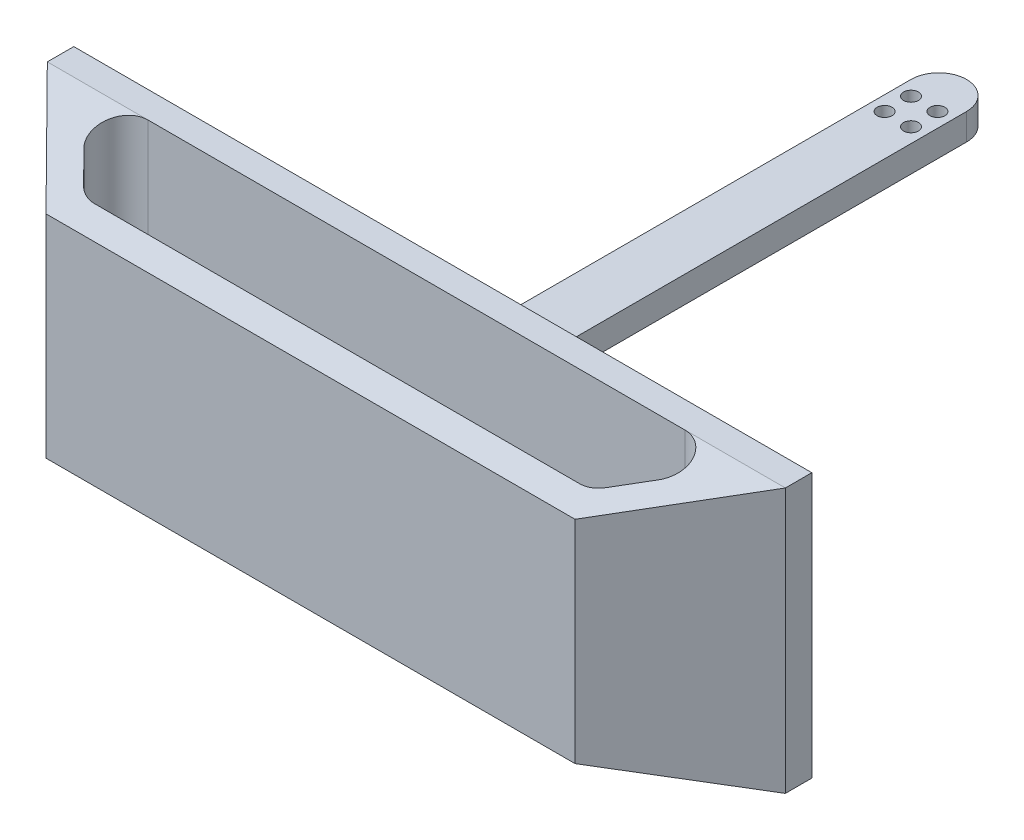
ISO-10303-21;
HEADER;
FILE_DESCRIPTION(('STEP AP214'),'2;1');
FILE_NAME('part.step','',(''),(''),'','','');
FILE_SCHEMA(('AUTOMOTIVE_DESIGN { 1 0 10303 214 1 1 1 1 }'));
ENDSEC;
DATA;
#1=APPLICATION_CONTEXT('core data for automotive mechanical design processes');
#2=APPLICATION_PROTOCOL_DEFINITION('international standard','automotive_design',2000,#1);
#3=PRODUCT_CONTEXT('',#1,'mechanical');
#4=PRODUCT('Part','Part','',(#3));
#5=PRODUCT_RELATED_PRODUCT_CATEGORY('part','',(#4));
#6=PRODUCT_DEFINITION_FORMATION('','',#4);
#7=PRODUCT_DEFINITION_CONTEXT('part definition',#1,'design');
#8=PRODUCT_DEFINITION('design','',#6,#7);
#9=PRODUCT_DEFINITION_SHAPE('','',#8);
#10=(LENGTH_UNIT() NAMED_UNIT(*) SI_UNIT(.MILLI.,.METRE.));
#11=(NAMED_UNIT(*) PLANE_ANGLE_UNIT() SI_UNIT($,.RADIAN.));
#12=(NAMED_UNIT(*) SI_UNIT($,.STERADIAN.) SOLID_ANGLE_UNIT());
#13=UNCERTAINTY_MEASURE_WITH_UNIT(LENGTH_MEASURE(1.E-05),#10,'distance_accuracy_value','');
#14=(GEOMETRIC_REPRESENTATION_CONTEXT(3) GLOBAL_UNCERTAINTY_ASSIGNED_CONTEXT((#13)) GLOBAL_UNIT_ASSIGNED_CONTEXT((#10,
#11,#12)) REPRESENTATION_CONTEXT('',''));
#15=CARTESIAN_POINT('',(0.,0.,0.));
#16=DIRECTION('',(0.,0.,1.));
#17=DIRECTION('',(1.,0.,0.));
#18=AXIS2_PLACEMENT_3D('',#15,#16,#17);
#19=CARTESIAN_POINT('',(0.,5.,-5.25));
#20=DIRECTION('',(0.,-1.,0.));
#21=DIRECTION('',(0.,0.,-1.));
#22=AXIS2_PLACEMENT_3D('',#19,#20,#21);
#23=PLANE('',#22);
#24=CARTESIAN_POINT('',(0.,5.,-5.25));
#25=DIRECTION('',(0.,1.,0.));
#26=DIRECTION('',(0.,0.,-1.));
#27=AXIS2_PLACEMENT_3D('',#24,#25,#26);
#28=CIRCLE('',#27,5.25);
#29=CARTESIAN_POINT('',(5.25,5.,-5.25));
#30=VERTEX_POINT('',#29);
#31=CARTESIAN_POINT('',(-5.25,5.,-5.25));
#32=VERTEX_POINT('',#31);
#33=EDGE_CURVE('E605',#30,#32,#28,.T.);
#34=ORIENTED_EDGE('',*,*,#33,.T.);
#35=DIRECTION('',(0.,0.,1.));
#36=VECTOR('',#35,1.);
#37=CARTESIAN_POINT('',(-5.25,5.,-5.25));
#38=LINE('',#37,#36);
#39=CARTESIAN_POINT('',(-5.24999999999999,5.,88.5));
#40=VERTEX_POINT('',#39);
#41=EDGE_CURVE('E608',#32,#40,#38,.T.);
#42=ORIENTED_EDGE('',*,*,#41,.T.);
#43=DIRECTION('',(1.,0.,0.));
#44=VECTOR('',#43,1.);
#45=CARTESIAN_POINT('',(-5.24999999999999,5.,88.5));
#46=LINE('',#45,#44);
#47=CARTESIAN_POINT('',(5.25000000000001,5.,88.5));
#48=VERTEX_POINT('',#47);
#49=EDGE_CURVE('E613',#40,#48,#46,.T.);
#50=ORIENTED_EDGE('',*,*,#49,.T.);
#51=DIRECTION('',(0.,0.,-1.));
#52=VECTOR('',#51,1.);
#53=CARTESIAN_POINT('',(5.25,5.,-5.25));
#54=LINE('',#53,#52);
#55=EDGE_CURVE('E617',#48,#30,#54,.T.);
#56=ORIENTED_EDGE('',*,*,#55,.T.);
#57=EDGE_LOOP('',(#34,#42,#50,#56));
#58=FACE_BOUND('',#57,.T.);
#59=CARTESIAN_POINT('',(-2.5,5.,-2.5));
#60=DIRECTION('',(0.,1.,0.));
#61=DIRECTION('',(0.,0.,1.));
#62=AXIS2_PLACEMENT_3D('',#59,#60,#61);
#63=CIRCLE('',#62,1.4);
#64=CARTESIAN_POINT('',(-2.5,5.,-1.1));
#65=VERTEX_POINT('',#64);
#66=EDGE_CURVE('E588',#65,#65,#63,.T.);
#67=ORIENTED_EDGE('',*,*,#66,.F.);
#68=EDGE_LOOP('',(#67));
#69=FACE_BOUND('',#68,.T.);
#70=CARTESIAN_POINT('',(2.5,5.,-2.5));
#71=DIRECTION('',(0.,1.,0.));
#72=DIRECTION('',(0.,0.,-1.));
#73=AXIS2_PLACEMENT_3D('',#70,#71,#72);
#74=CIRCLE('',#73,1.4);
#75=CARTESIAN_POINT('',(2.5,5.,-3.9));
#76=VERTEX_POINT('',#75);
#77=EDGE_CURVE('E594',#76,#76,#74,.T.);
#78=ORIENTED_EDGE('',*,*,#77,.F.);
#79=EDGE_LOOP('',(#78));
#80=FACE_BOUND('',#79,.T.);
#81=CARTESIAN_POINT('',(-2.50000000000001,5.,2.5));
#82=DIRECTION('',(0.,1.,0.));
#83=DIRECTION('',(0.,0.,-1.));
#84=AXIS2_PLACEMENT_3D('',#81,#82,#83);
#85=CIRCLE('',#84,1.4);
#86=CARTESIAN_POINT('',(-2.50000000000001,5.,1.1));
#87=VERTEX_POINT('',#86);
#88=EDGE_CURVE('E834',#87,#87,#85,.T.);
#89=ORIENTED_EDGE('',*,*,#88,.F.);
#90=EDGE_LOOP('',(#89));
#91=FACE_BOUND('',#90,.T.);
#92=CARTESIAN_POINT('',(2.49999999999999,5.,2.5));
#93=DIRECTION('',(0.,1.,0.));
#94=DIRECTION('',(0.,0.,1.));
#95=AXIS2_PLACEMENT_3D('',#92,#93,#94);
#96=CIRCLE('',#95,1.4);
#97=CARTESIAN_POINT('',(2.49999999999999,5.,3.9));
#98=VERTEX_POINT('',#97);
#99=EDGE_CURVE('E826',#98,#98,#96,.T.);
#100=ORIENTED_EDGE('',*,*,#99,.F.);
#101=EDGE_LOOP('',(#100));
#102=FACE_BOUND('',#101,.T.);
#103=ADVANCED_FACE('F52',(#58,#69,#80,#91,#102),#23,.F.);
#104=CARTESIAN_POINT('',(0.,0.,-5.25));
#105=DIRECTION('',(0.,-1.,0.));
#106=DIRECTION('',(0.,0.,-1.));
#107=AXIS2_PLACEMENT_3D('',#104,#105,#106);
#108=PLANE('',#107);
#109=CARTESIAN_POINT('',(-2.50000000000001,0.,2.5));
#110=DIRECTION('',(0.,1.,0.));
#111=DIRECTION('',(0.,0.,-1.));
#112=AXIS2_PLACEMENT_3D('',#109,#110,#111);
#113=CIRCLE('',#112,1.4);
#114=CARTESIAN_POINT('',(-2.50000000000001,0.,1.1));
#115=VERTEX_POINT('',#114);
#116=EDGE_CURVE('E830',#115,#115,#113,.T.);
#117=ORIENTED_EDGE('',*,*,#116,.T.);
#118=EDGE_LOOP('',(#117));
#119=FACE_BOUND('',#118,.T.);
#120=CARTESIAN_POINT('',(-2.5,0.,-2.5));
#121=DIRECTION('',(0.,1.,0.));
#122=DIRECTION('',(0.,0.,1.));
#123=AXIS2_PLACEMENT_3D('',#120,#121,#122);
#124=CIRCLE('',#123,1.4);
#125=CARTESIAN_POINT('',(-2.5,0.,-1.1));
#126=VERTEX_POINT('',#125);
#127=EDGE_CURVE('E591',#126,#126,#124,.T.);
#128=ORIENTED_EDGE('',*,*,#127,.T.);
#129=EDGE_LOOP('',(#128));
#130=FACE_BOUND('',#129,.T.);
#131=CARTESIAN_POINT('',(0.,0.,-5.25));
#132=DIRECTION('',(0.,1.,0.));
#133=DIRECTION('',(0.,0.,-1.));
#134=AXIS2_PLACEMENT_3D('',#131,#132,#133);
#135=CIRCLE('',#134,5.25);
#136=CARTESIAN_POINT('',(5.25,0.,-5.25));
#137=VERTEX_POINT('',#136);
#138=CARTESIAN_POINT('',(-5.25,0.,-5.25));
#139=VERTEX_POINT('',#138);
#140=EDGE_CURVE('E598',#137,#139,#135,.T.);
#141=ORIENTED_EDGE('',*,*,#140,.F.);
#142=DIRECTION('',(0.,0.,-1.));
#143=VECTOR('',#142,1.);
#144=CARTESIAN_POINT('',(5.25,0.,-5.25));
#145=LINE('',#144,#143);
#146=CARTESIAN_POINT('',(5.25000000000001,0.,88.5));
#147=VERTEX_POINT('',#146);
#148=EDGE_CURVE('E609',#147,#137,#145,.T.);
#149=ORIENTED_EDGE('',*,*,#148,.F.);
#150=DIRECTION('',(1.,0.,0.));
#151=VECTOR('',#150,1.);
#152=CARTESIAN_POINT('',(-5.24999999999999,0.,88.5));
#153=LINE('',#152,#151);
#154=CARTESIAN_POINT('',(-5.24999999999999,0.,88.5));
#155=VERTEX_POINT('',#154);
#156=EDGE_CURVE('E629',#155,#147,#153,.T.);
#157=ORIENTED_EDGE('',*,*,#156,.F.);
#158=DIRECTION('',(0.,0.,1.));
#159=VECTOR('',#158,1.);
#160=CARTESIAN_POINT('',(-5.25,0.,-5.25));
#161=LINE('',#160,#159);
#162=EDGE_CURVE('E625',#139,#155,#161,.T.);
#163=ORIENTED_EDGE('',*,*,#162,.F.);
#164=EDGE_LOOP('',(#141,#149,#157,#163));
#165=FACE_BOUND('',#164,.T.);
#166=CARTESIAN_POINT('',(2.5,0.,-2.5));
#167=DIRECTION('',(0.,1.,0.));
#168=DIRECTION('',(0.,0.,-1.));
#169=AXIS2_PLACEMENT_3D('',#166,#167,#168);
#170=CIRCLE('',#169,1.4);
#171=CARTESIAN_POINT('',(2.5,0.,-3.9));
#172=VERTEX_POINT('',#171);
#173=EDGE_CURVE('E601',#172,#172,#170,.T.);
#174=ORIENTED_EDGE('',*,*,#173,.T.);
#175=EDGE_LOOP('',(#174));
#176=FACE_BOUND('',#175,.T.);
#177=CARTESIAN_POINT('',(2.49999999999999,0.,2.5));
#178=DIRECTION('',(0.,1.,0.));
#179=DIRECTION('',(0.,0.,1.));
#180=AXIS2_PLACEMENT_3D('',#177,#178,#179);
#181=CIRCLE('',#180,1.4);
#182=CARTESIAN_POINT('',(2.49999999999999,0.,3.9));
#183=VERTEX_POINT('',#182);
#184=EDGE_CURVE('E668',#183,#183,#181,.T.);
#185=ORIENTED_EDGE('',*,*,#184,.T.);
#186=EDGE_LOOP('',(#185));
#187=FACE_BOUND('',#186,.T.);
#188=ADVANCED_FACE('F327',(#119,#130,#165,#176,#187),#108,.T.);
#189=CARTESIAN_POINT('',(0.,5.,-5.25));
#190=DIRECTION('',(0.,-1.,0.));
#191=DIRECTION('',(0.,0.,-1.));
#192=AXIS2_PLACEMENT_3D('',#189,#190,#191);
#193=CYLINDRICAL_SURFACE('',#192,5.25);
#194=ORIENTED_EDGE('',*,*,#140,.T.);
#195=DIRECTION('',(0.,-1.,0.));
#196=VECTOR('',#195,1.);
#197=CARTESIAN_POINT('',(-5.25,5.,-5.25));
#198=LINE('',#197,#196);
#199=EDGE_CURVE('E647',#32,#139,#198,.T.);
#200=ORIENTED_EDGE('',*,*,#199,.F.);
#201=ORIENTED_EDGE('',*,*,#33,.F.);
#202=DIRECTION('',(0.,-1.,0.));
#203=VECTOR('',#202,1.);
#204=CARTESIAN_POINT('',(5.25,5.,-5.25));
#205=LINE('',#204,#203);
#206=EDGE_CURVE('E621',#30,#137,#205,.T.);
#207=ORIENTED_EDGE('',*,*,#206,.T.);
#208=EDGE_LOOP('',(#194,#200,#201,#207));
#209=FACE_BOUND('',#208,.T.);
#210=ADVANCED_FACE('F334',(#209),#193,.T.);
#211=CARTESIAN_POINT('',(-5.25,5.,-5.25));
#212=DIRECTION('',(1.,0.,0.));
#213=DIRECTION('',(0.,0.,-1.));
#214=AXIS2_PLACEMENT_3D('',#211,#212,#213);
#215=PLANE('',#214);
#216=ORIENTED_EDGE('',*,*,#162,.T.);
#217=DIRECTION('',(0.,-1.,0.));
#218=VECTOR('',#217,1.);
#219=CARTESIAN_POINT('',(-5.24999999999999,5.,88.5));
#220=LINE('',#219,#218);
#221=EDGE_CURVE('E643',#40,#155,#220,.T.);
#222=ORIENTED_EDGE('',*,*,#221,.F.);
#223=ORIENTED_EDGE('',*,*,#41,.F.);
#224=ORIENTED_EDGE('',*,*,#199,.T.);
#225=EDGE_LOOP('',(#216,#222,#223,#224));
#226=FACE_BOUND('',#225,.T.);
#227=ADVANCED_FACE('F346',(#226),#215,.F.);
#228=CARTESIAN_POINT('',(5.25,5.,-5.25));
#229=DIRECTION('',(-1.,0.,0.));
#230=DIRECTION('',(0.,0.,1.));
#231=AXIS2_PLACEMENT_3D('',#228,#229,#230);
#232=PLANE('',#231);
#233=ORIENTED_EDGE('',*,*,#148,.T.);
#234=ORIENTED_EDGE('',*,*,#206,.F.);
#235=ORIENTED_EDGE('',*,*,#55,.F.);
#236=DIRECTION('',(0.,-1.,0.));
#237=VECTOR('',#236,1.);
#238=CARTESIAN_POINT('',(5.25000000000001,5.,88.5));
#239=LINE('',#238,#237);
#240=EDGE_CURVE('E639',#48,#147,#239,.T.);
#241=ORIENTED_EDGE('',*,*,#240,.T.);
#242=EDGE_LOOP('',(#233,#234,#235,#241));
#243=FACE_BOUND('',#242,.T.);
#244=ADVANCED_FACE('F343',(#243),#232,.F.);
#245=CARTESIAN_POINT('',(-2.5,5.,-2.5));
#246=DIRECTION('',(0.,-1.,0.));
#247=DIRECTION('',(0.,0.,-1.));
#248=AXIS2_PLACEMENT_3D('',#245,#246,#247);
#249=CYLINDRICAL_SURFACE('',#248,1.4);
#250=ORIENTED_EDGE('',*,*,#66,.T.);
#251=EDGE_LOOP('',(#250));
#252=FACE_BOUND('',#251,.T.);
#253=ORIENTED_EDGE('',*,*,#127,.F.);
#254=EDGE_LOOP('',(#253));
#255=FACE_BOUND('',#254,.T.);
#256=ADVANCED_FACE('F340',(#252,#255),#249,.F.);
#257=CARTESIAN_POINT('',(2.5,5.,-2.5));
#258=DIRECTION('',(0.,-1.,0.));
#259=DIRECTION('',(0.,0.,-1.));
#260=AXIS2_PLACEMENT_3D('',#257,#258,#259);
#261=CYLINDRICAL_SURFACE('',#260,1.4);
#262=ORIENTED_EDGE('',*,*,#77,.T.);
#263=EDGE_LOOP('',(#262));
#264=FACE_BOUND('',#263,.T.);
#265=ORIENTED_EDGE('',*,*,#173,.F.);
#266=EDGE_LOOP('',(#265));
#267=FACE_BOUND('',#266,.T.);
#268=ADVANCED_FACE('F537',(#264,#267),#261,.F.);
#269=CARTESIAN_POINT('',(-2.50000000000001,5.,2.5));
#270=DIRECTION('',(0.,-1.,0.));
#271=DIRECTION('',(0.,0.,-1.));
#272=AXIS2_PLACEMENT_3D('',#269,#270,#271);
#273=CYLINDRICAL_SURFACE('',#272,1.4);
#274=ORIENTED_EDGE('',*,*,#88,.T.);
#275=EDGE_LOOP('',(#274));
#276=FACE_BOUND('',#275,.T.);
#277=ORIENTED_EDGE('',*,*,#116,.F.);
#278=EDGE_LOOP('',(#277));
#279=FACE_BOUND('',#278,.T.);
#280=ADVANCED_FACE('F527',(#276,#279),#273,.F.);
#281=CARTESIAN_POINT('',(2.49999999999999,5.,2.5));
#282=DIRECTION('',(0.,-1.,0.));
#283=DIRECTION('',(0.,0.,-1.));
#284=AXIS2_PLACEMENT_3D('',#281,#282,#283);
#285=CYLINDRICAL_SURFACE('',#284,1.4);
#286=ORIENTED_EDGE('',*,*,#99,.T.);
#287=EDGE_LOOP('',(#286));
#288=FACE_BOUND('',#287,.T.);
#289=ORIENTED_EDGE('',*,*,#184,.F.);
#290=EDGE_LOOP('',(#289));
#291=FACE_BOUND('',#290,.T.);
#292=ADVANCED_FACE('F518',(#288,#291),#285,.F.);
#293=CARTESIAN_POINT('',(0.,0.,88.5));
#294=DIRECTION('',(0.,0.,-1.));
#295=DIRECTION('',(-1.,0.,0.));
#296=AXIS2_PLACEMENT_3D('',#293,#294,#295);
#297=PLANE('',#296);
#298=ORIENTED_EDGE('',*,*,#221,.T.);
#299=ORIENTED_EDGE('',*,*,#156,.T.);
#300=ORIENTED_EDGE('',*,*,#240,.F.);
#301=ORIENTED_EDGE('',*,*,#49,.F.);
#302=EDGE_LOOP('',(#298,#299,#300,#301));
#303=FACE_BOUND('',#302,.T.);
#304=CARTESIAN_POINT('',(-67.,0.,88.5));
#305=DIRECTION('',(0.,0.,1.));
#306=DIRECTION('',(1.,0.,0.));
#307=AXIS2_PLACEMENT_3D('',#304,#305,#306);
#308=CIRCLE('',#307,1.4);
#309=CARTESIAN_POINT('',(-65.6,0.,88.5));
#310=VERTEX_POINT('',#309);
#311=EDGE_CURVE('E808',#310,#310,#308,.T.);
#312=ORIENTED_EDGE('',*,*,#311,.T.);
#313=EDGE_LOOP('',(#312));
#314=FACE_BOUND('',#313,.T.);
#315=DIRECTION('',(0.,1.,0.));
#316=VECTOR('',#315,1.);
#317=CARTESIAN_POINT('',(69.75,-25.,88.5));
#318=LINE('',#317,#316);
#319=CARTESIAN_POINT('',(69.75,-25.,88.5));
#320=VERTEX_POINT('',#319);
#321=CARTESIAN_POINT('',(69.75,25.,88.5));
#322=VERTEX_POINT('',#321);
#323=EDGE_CURVE('E815',#320,#322,#318,.T.);
#324=ORIENTED_EDGE('',*,*,#323,.F.);
#325=DIRECTION('',(1.,0.,0.));
#326=VECTOR('',#325,1.);
#327=CARTESIAN_POINT('',(-69.75,-25.,88.5));
#328=LINE('',#327,#326);
#329=CARTESIAN_POINT('',(-69.75,-25.,88.5));
#330=VERTEX_POINT('',#329);
#331=EDGE_CURVE('E681',#330,#320,#328,.T.);
#332=ORIENTED_EDGE('',*,*,#331,.F.);
#333=DIRECTION('',(0.,-1.,0.));
#334=VECTOR('',#333,1.);
#335=CARTESIAN_POINT('',(-69.75,-25.,88.5));
#336=LINE('',#335,#334);
#337=CARTESIAN_POINT('',(-69.75,25.,88.5));
#338=VERTEX_POINT('',#337);
#339=EDGE_CURVE('E821',#338,#330,#336,.T.);
#340=ORIENTED_EDGE('',*,*,#339,.F.);
#341=DIRECTION('',(-1.,0.,0.));
#342=VECTOR('',#341,1.);
#343=CARTESIAN_POINT('',(-69.75,25.,88.5));
#344=LINE('',#343,#342);
#345=EDGE_CURVE('E818',#322,#338,#344,.T.);
#346=ORIENTED_EDGE('',*,*,#345,.F.);
#347=EDGE_LOOP('',(#324,#332,#340,#346));
#348=FACE_BOUND('',#347,.T.);
#349=CARTESIAN_POINT('',(67.,0.,88.5));
#350=DIRECTION('',(0.,0.,1.));
#351=DIRECTION('',(-1.,0.,0.));
#352=AXIS2_PLACEMENT_3D('',#349,#350,#351);
#353=CIRCLE('',#352,1.4);
#354=CARTESIAN_POINT('',(65.6,0.,88.5));
#355=VERTEX_POINT('',#354);
#356=EDGE_CURVE('E804',#355,#355,#353,.T.);
#357=ORIENTED_EDGE('',*,*,#356,.T.);
#358=EDGE_LOOP('',(#357));
#359=FACE_BOUND('',#358,.T.);
#360=ADVANCED_FACE('F509',(#303,#314,#348,#359),#297,.T.);
#361=CARTESIAN_POINT('',(69.75,-25.,93.5));
#362=DIRECTION('',(-1.,0.,0.));
#363=DIRECTION('',(0.,0.,1.));
#364=AXIS2_PLACEMENT_3D('',#361,#362,#363);
#365=PLANE('',#364);
#366=ORIENTED_EDGE('',*,*,#323,.T.);
#367=DIRECTION('',(0.,0.,-1.));
#368=VECTOR('',#367,1.);
#369=CARTESIAN_POINT('',(69.75,25.,93.5));
#370=LINE('',#369,#368);
#371=CARTESIAN_POINT('',(69.75,25.,93.5));
#372=VERTEX_POINT('',#371);
#373=EDGE_CURVE('E665',#372,#322,#370,.T.);
#374=ORIENTED_EDGE('',*,*,#373,.F.);
#375=DIRECTION('',(0.,1.,0.));
#376=VECTOR('',#375,1.);
#377=CARTESIAN_POINT('',(69.75,0.,93.5));
#378=LINE('',#377,#376);
#379=CARTESIAN_POINT('',(69.75,-25.,93.5));
#380=VERTEX_POINT('',#379);
#381=EDGE_CURVE('E677',#380,#372,#378,.T.);
#382=ORIENTED_EDGE('',*,*,#381,.F.);
#383=DIRECTION('',(0.,0.,-1.));
#384=VECTOR('',#383,1.);
#385=CARTESIAN_POINT('',(69.75,-25.,93.5));
#386=LINE('',#385,#384);
#387=EDGE_CURVE('E652',#380,#320,#386,.T.);
#388=ORIENTED_EDGE('',*,*,#387,.T.);
#389=EDGE_LOOP('',(#366,#374,#382,#388));
#390=FACE_BOUND('',#389,.T.);
#391=ADVANCED_FACE('F501',(#390),#365,.F.);
#392=CARTESIAN_POINT('',(-69.75,25.,93.5));
#393=DIRECTION('',(0.,-1.,0.));
#394=DIRECTION('',(0.,0.,-1.));
#395=AXIS2_PLACEMENT_3D('',#392,#393,#394);
#396=PLANE('',#395);
#397=ORIENTED_EDGE('',*,*,#345,.T.);
#398=DIRECTION('',(0.,0.,-1.));
#399=VECTOR('',#398,1.);
#400=CARTESIAN_POINT('',(-69.75,25.,93.5));
#401=LINE('',#400,#399);
#402=CARTESIAN_POINT('',(-69.75,25.,93.5));
#403=VERTEX_POINT('',#402);
#404=EDGE_CURVE('E661',#403,#338,#401,.T.);
#405=ORIENTED_EDGE('',*,*,#404,.F.);
#406=DIRECTION('',(1.,0.,0.));
#407=VECTOR('',#406,1.);
#408=CARTESIAN_POINT('',(0.,25.,93.5));
#409=LINE('',#408,#407);
#410=CARTESIAN_POINT('',(-50.7584747758871,25.,93.5));
#411=VERTEX_POINT('',#410);
#412=EDGE_CURVE('E77',#411,#403,#409,.F.);
#413=ORIENTED_EDGE('',*,*,#412,.F.);
#414=DIRECTION('',(1.,0.,0.));
#415=VECTOR('',#414,1.);
#416=CARTESIAN_POINT('',(0.,25.,93.5));
#417=LINE('',#416,#415);
#418=CARTESIAN_POINT('',(50.7584747758872,25.,93.5));
#419=VERTEX_POINT('',#418);
#420=EDGE_CURVE('E126',#411,#419,#417,.T.);
#421=ORIENTED_EDGE('',*,*,#420,.T.);
#422=EDGE_CURVE('E94',#372,#419,#409,.F.);
#423=ORIENTED_EDGE('',*,*,#422,.F.);
#424=ORIENTED_EDGE('',*,*,#373,.T.);
#425=EDGE_LOOP('',(#397,#405,#413,#421,#423,#424));
#426=FACE_BOUND('',#425,.T.);
#427=ADVANCED_FACE('F203',(#426),#396,.F.);
#428=CARTESIAN_POINT('',(-69.75,-25.,93.5));
#429=DIRECTION('',(1.,0.,0.));
#430=DIRECTION('',(0.,0.,-1.));
#431=AXIS2_PLACEMENT_3D('',#428,#429,#430);
#432=PLANE('',#431);
#433=ORIENTED_EDGE('',*,*,#339,.T.);
#434=DIRECTION('',(0.,0.,-1.));
#435=VECTOR('',#434,1.);
#436=CARTESIAN_POINT('',(-69.75,-25.,93.5));
#437=LINE('',#436,#435);
#438=CARTESIAN_POINT('',(-69.75,-25.,93.5));
#439=VERTEX_POINT('',#438);
#440=EDGE_CURVE('E656',#439,#330,#437,.T.);
#441=ORIENTED_EDGE('',*,*,#440,.F.);
#442=DIRECTION('',(0.,1.,0.));
#443=VECTOR('',#442,1.);
#444=CARTESIAN_POINT('',(-69.75,0.,93.5));
#445=LINE('',#444,#443);
#446=EDGE_CURVE('E671',#403,#439,#445,.F.);
#447=ORIENTED_EDGE('',*,*,#446,.F.);
#448=ORIENTED_EDGE('',*,*,#404,.T.);
#449=EDGE_LOOP('',(#433,#441,#447,#448));
#450=FACE_BOUND('',#449,.T.);
#451=ADVANCED_FACE('F485',(#450),#432,.F.);
#452=CARTESIAN_POINT('',(-69.75,-25.,93.5));
#453=DIRECTION('',(0.,1.,0.));
#454=DIRECTION('',(0.,0.,1.));
#455=AXIS2_PLACEMENT_3D('',#452,#453,#454);
#456=PLANE('',#455);
#457=ORIENTED_EDGE('',*,*,#331,.T.);
#458=ORIENTED_EDGE('',*,*,#387,.F.);
#459=DIRECTION('',(1.,0.,0.));
#460=VECTOR('',#459,1.);
#461=CARTESIAN_POINT('',(0.,-25.,93.5));
#462=LINE('',#461,#460);
#463=CARTESIAN_POINT('',(50.7584747758872,-25.,93.5));
#464=VERTEX_POINT('',#463);
#465=EDGE_CURVE('E68',#464,#380,#462,.T.);
#466=ORIENTED_EDGE('',*,*,#465,.F.);
#467=CARTESIAN_POINT('',(-50.7584747758871,-25.,93.5));
#468=VERTEX_POINT('',#467);
#469=EDGE_CURVE('E201',#468,#464,#462,.T.);
#470=ORIENTED_EDGE('',*,*,#469,.F.);
#471=EDGE_CURVE('E657',#439,#468,#462,.T.);
#472=ORIENTED_EDGE('',*,*,#471,.F.);
#473=ORIENTED_EDGE('',*,*,#440,.T.);
#474=EDGE_LOOP('',(#457,#458,#466,#470,#472,#473));
#475=FACE_BOUND('',#474,.T.);
#476=ADVANCED_FACE('F475',(#475),#456,.F.);
#477=CARTESIAN_POINT('',(-67.,0.,93.5));
#478=DIRECTION('',(0.,0.,-1.));
#479=DIRECTION('',(-1.,0.,0.));
#480=AXIS2_PLACEMENT_3D('',#477,#478,#479);
#481=CYLINDRICAL_SURFACE('',#480,1.4);
#482=CARTESIAN_POINT('',(-67.,0.,93.5));
#483=DIRECTION('',(0.,0.,1.));
#484=DIRECTION('',(1.,0.,0.));
#485=AXIS2_PLACEMENT_3D('',#482,#483,#484);
#486=CIRCLE('',#485,1.4);
#487=CARTESIAN_POINT('',(-65.6,0.,93.5));
#488=VERTEX_POINT('',#487);
#489=EDGE_CURVE('E803',#488,#488,#486,.T.);
#490=ORIENTED_EDGE('',*,*,#489,.T.);
#491=EDGE_LOOP('',(#490));
#492=FACE_BOUND('',#491,.T.);
#493=ORIENTED_EDGE('',*,*,#311,.F.);
#494=EDGE_LOOP('',(#493));
#495=FACE_BOUND('',#494,.T.);
#496=ADVANCED_FACE('F465',(#492,#495),#481,.F.);
#497=CARTESIAN_POINT('',(67.,0.,93.5));
#498=DIRECTION('',(0.,0.,-1.));
#499=DIRECTION('',(-1.,0.,0.));
#500=AXIS2_PLACEMENT_3D('',#497,#498,#499);
#501=CYLINDRICAL_SURFACE('',#500,1.4);
#502=CARTESIAN_POINT('',(67.,0.,93.5));
#503=DIRECTION('',(0.,0.,1.));
#504=DIRECTION('',(-1.,0.,0.));
#505=AXIS2_PLACEMENT_3D('',#502,#503,#504);
#506=CIRCLE('',#505,1.4);
#507=CARTESIAN_POINT('',(65.6,0.,93.5));
#508=VERTEX_POINT('',#507);
#509=EDGE_CURVE('E773',#508,#508,#506,.T.);
#510=ORIENTED_EDGE('',*,*,#509,.T.);
#511=EDGE_LOOP('',(#510));
#512=FACE_BOUND('',#511,.T.);
#513=ORIENTED_EDGE('',*,*,#356,.F.);
#514=EDGE_LOOP('',(#513));
#515=FACE_BOUND('',#514,.T.);
#516=ADVANCED_FACE('F455',(#512,#515),#501,.F.);
#517=CARTESIAN_POINT('',(0.,0.,93.5));
#518=DIRECTION('',(0.,0.,1.));
#519=DIRECTION('',(1.,0.,0.));
#520=AXIS2_PLACEMENT_3D('',#517,#518,#519);
#521=PLANE('',#520);
#522=ORIENTED_EDGE('',*,*,#509,.F.);
#523=EDGE_LOOP('',(#522));
#524=FACE_BOUND('',#523,.T.);
#525=ADVANCED_FACE('F312',(#524),#521,.F.);
#526=ORIENTED_EDGE('',*,*,#489,.F.);
#527=EDGE_LOOP('',(#526));
#528=FACE_BOUND('',#527,.T.);
#529=ADVANCED_FACE('F309',(#528),#521,.F.);
#530=CARTESIAN_POINT('',(0.,0.,113.5));
#531=DIRECTION('',(0.,0.,-1.));
#532=DIRECTION('',(-1.,0.,0.));
#533=AXIS2_PLACEMENT_3D('',#530,#531,#532);
#534=PLANE('',#533);
#535=DIRECTION('',(0.,1.,0.));
#536=VECTOR('',#535,1.);
#537=CARTESIAN_POINT('',(50.,-20.,113.5));
#538=LINE('',#537,#536);
#539=CARTESIAN_POINT('',(50.,-20.,113.5));
#540=VERTEX_POINT('',#539);
#541=CARTESIAN_POINT('',(50.,20.,113.5));
#542=VERTEX_POINT('',#541);
#543=EDGE_CURVE('E232',#540,#542,#538,.T.);
#544=ORIENTED_EDGE('',*,*,#543,.T.);
#545=DIRECTION('',(-1.,0.,0.));
#546=VECTOR('',#545,1.);
#547=CARTESIAN_POINT('',(-50.,20.,113.5));
#548=LINE('',#547,#546);
#549=CARTESIAN_POINT('',(-50.,20.,113.5));
#550=VERTEX_POINT('',#549);
#551=EDGE_CURVE('E280',#542,#550,#548,.T.);
#552=ORIENTED_EDGE('',*,*,#551,.T.);
#553=DIRECTION('',(0.,-1.,0.));
#554=VECTOR('',#553,1.);
#555=CARTESIAN_POINT('',(-50.,-20.,113.5));
#556=LINE('',#555,#554);
#557=CARTESIAN_POINT('',(-50.,-20.,113.5));
#558=VERTEX_POINT('',#557);
#559=EDGE_CURVE('E294',#550,#558,#556,.T.);
#560=ORIENTED_EDGE('',*,*,#559,.T.);
#561=DIRECTION('',(1.,0.,0.));
#562=VECTOR('',#561,1.);
#563=CARTESIAN_POINT('',(-50.,-20.,113.5));
#564=LINE('',#563,#562);
#565=EDGE_CURVE('E240',#558,#540,#564,.T.);
#566=ORIENTED_EDGE('',*,*,#565,.T.);
#567=EDGE_LOOP('',(#544,#552,#560,#566));
#568=FACE_BOUND('',#567,.T.);
#569=ADVANCED_FACE('F265',(#568),#534,.F.);
#570=CARTESIAN_POINT('',(-82.0599636104738,0.,81.0342140653429));
#571=DIRECTION('',(0.711539921163849,0.,-0.702645672149301));
#572=DIRECTION('',(-0.702645672149301,0.,-0.711539921163849));
#573=AXIS2_PLACEMENT_3D('',#570,#571,#572);
#574=PLANE('',#573);
#575=DIRECTION('',(0.6917858010321,0.175135645830911,0.700542583323645));
#576=VECTOR('',#575,1.);
#577=CARTESIAN_POINT('',(-69.75,-25.,93.5));
#578=LINE('',#577,#576);
#579=EDGE_CURVE('E208',#439,#558,#578,.T.);
#580=ORIENTED_EDGE('',*,*,#579,.T.);
#581=ORIENTED_EDGE('',*,*,#559,.F.);
#582=DIRECTION('',(0.691785801032099,-0.175135645830911,0.700542583323645));
#583=VECTOR('',#582,1.);
#584=CARTESIAN_POINT('',(-69.75,25.,93.5));
#585=LINE('',#584,#583);
#586=EDGE_CURVE('E212',#403,#550,#585,.T.);
#587=ORIENTED_EDGE('',*,*,#586,.F.);
#588=ORIENTED_EDGE('',*,*,#446,.T.);
#589=EDGE_LOOP('',(#580,#581,#587,#588));
#590=FACE_BOUND('',#589,.T.);
#591=ADVANCED_FACE('F300',(#590),#574,.F.);
#592=CARTESIAN_POINT('',(0.,45.5294117647059,11.3823529411765));
#593=DIRECTION('',(0.,-0.970142500145332,-0.242535625036333));
#594=DIRECTION('',(0.,0.242535625036333,-0.970142500145332));
#595=AXIS2_PLACEMENT_3D('',#592,#593,#594);
#596=PLANE('',#595);
#597=ORIENTED_EDGE('',*,*,#422,.T.);
#598=CARTESIAN_POINT('',(50.7584747758872,23.75,98.5));
#599=DIRECTION('',(0.,-0.970142500145332,-0.242535625036333));
#600=DIRECTION('',(0.,-0.242535625036333,0.970142500145332));
#601=AXIS2_PLACEMENT_3D('',#598,#599,#600);
#602=ELLIPSE('',#601,5.15388203202208,5.);
#603=CARTESIAN_POINT('',(54.3161743817064,22.8716929098134,102.013228360747));
#604=VERTEX_POINT('',#603);
#605=EDGE_CURVE('E61',#419,#604,#602,.T.);
#606=ORIENTED_EDGE('',*,*,#605,.T.);
#607=DIRECTION('',(-0.691785801032101,-0.175135645830911,0.700542583323644));
#608=VECTOR('',#607,1.);
#609=CARTESIAN_POINT('',(74.9893654043414,28.10541215605,81.0783513757998));
#610=LINE('',#609,#608);
#611=CARTESIAN_POINT('',(49.3786743817064,21.6216929098134,107.013228360747));
#612=VERTEX_POINT('',#611);
#613=EDGE_CURVE('E113',#604,#612,#610,.T.);
#614=ORIENTED_EDGE('',*,*,#613,.T.);
#615=CARTESIAN_POINT('',(45.8209747758872,22.5,103.5));
#616=DIRECTION('',(0.,-0.970142500145332,-0.242535625036333));
#617=DIRECTION('',(0.,-0.242535625036333,0.970142500145332));
#618=AXIS2_PLACEMENT_3D('',#615,#616,#617);
#619=ELLIPSE('',#618,5.15388203202208,5.);
#620=CARTESIAN_POINT('',(45.8209747758872,21.25,108.5));
#621=VERTEX_POINT('',#620);
#622=EDGE_CURVE('E157',#612,#621,#619,.T.);
#623=ORIENTED_EDGE('',*,*,#622,.T.);
#624=DIRECTION('',(-1.,0.,0.));
#625=VECTOR('',#624,1.);
#626=CARTESIAN_POINT('',(0.,21.25,108.5));
#627=LINE('',#626,#625);
#628=CARTESIAN_POINT('',(-45.8209747758872,21.25,108.5));
#629=VERTEX_POINT('',#628);
#630=EDGE_CURVE('E127',#621,#629,#627,.T.);
#631=ORIENTED_EDGE('',*,*,#630,.T.);
#632=CARTESIAN_POINT('',(-45.8209747758872,22.5,103.5));
#633=DIRECTION('',(0.,-0.970142500145332,-0.242535625036333));
#634=DIRECTION('',(0.,-0.242535625036333,0.970142500145332));
#635=AXIS2_PLACEMENT_3D('',#632,#633,#634);
#636=ELLIPSE('',#635,5.15388203202208,5.);
#637=CARTESIAN_POINT('',(-49.3786743817064,21.6216929098134,107.013228360747));
#638=VERTEX_POINT('',#637);
#639=EDGE_CURVE('E135',#629,#638,#636,.T.);
#640=ORIENTED_EDGE('',*,*,#639,.T.);
#641=DIRECTION('',(-0.6917858010321,0.175135645830911,-0.700542583323645));
#642=VECTOR('',#641,1.);
#643=CARTESIAN_POINT('',(-74.9893654043414,28.1054121560501,81.0783513757997));
#644=LINE('',#643,#642);
#645=CARTESIAN_POINT('',(-54.3161743817064,22.8716929098134,102.013228360747));
#646=VERTEX_POINT('',#645);
#647=EDGE_CURVE('E178',#638,#646,#644,.T.);
#648=ORIENTED_EDGE('',*,*,#647,.T.);
#649=CARTESIAN_POINT('',(-50.7584747758871,23.75,98.5));
#650=DIRECTION('',(0.,-0.970142500145332,-0.242535625036333));
#651=DIRECTION('',(0.,-0.242535625036333,0.970142500145332));
#652=AXIS2_PLACEMENT_3D('',#649,#650,#651);
#653=ELLIPSE('',#652,5.15388203202208,5.);
#654=EDGE_CURVE('E149',#646,#411,#653,.T.);
#655=ORIENTED_EDGE('',*,*,#654,.T.);
#656=ORIENTED_EDGE('',*,*,#412,.T.);
#657=ORIENTED_EDGE('',*,*,#586,.T.);
#658=ORIENTED_EDGE('',*,*,#551,.F.);
#659=DIRECTION('',(-0.691785801032099,-0.175135645830911,0.700542583323645));
#660=VECTOR('',#659,1.);
#661=CARTESIAN_POINT('',(69.75,25.,93.5));
#662=LINE('',#661,#660);
#663=EDGE_CURVE('E226',#372,#542,#662,.T.);
#664=ORIENTED_EDGE('',*,*,#663,.F.);
#665=EDGE_LOOP('',(#597,#606,#614,#623,#631,#640,#648,#655,#656,#657,#658,#664));
#666=FACE_BOUND('',#665,.T.);
#667=ADVANCED_FACE('F111',(#666),#596,.F.);
#668=CARTESIAN_POINT('',(0.,-45.5294117647059,11.3823529411765));
#669=DIRECTION('',(0.,0.970142500145332,-0.242535625036333));
#670=DIRECTION('',(0.,0.242535625036333,0.970142500145332));
#671=AXIS2_PLACEMENT_3D('',#668,#669,#670);
#672=PLANE('',#671);
#673=DIRECTION('',(0.6917858010321,0.175135645830911,0.700542583323645));
#674=VECTOR('',#673,1.);
#675=CARTESIAN_POINT('',(-74.9893654043414,-28.1054121560501,81.0783513757997));
#676=LINE('',#675,#674);
#677=CARTESIAN_POINT('',(-54.3161743817064,-22.8716929098134,102.013228360747));
#678=VERTEX_POINT('',#677);
#679=CARTESIAN_POINT('',(-49.3786743817064,-21.6216929098134,107.013228360747));
#680=VERTEX_POINT('',#679);
#681=EDGE_CURVE('E651',#678,#680,#676,.T.);
#682=ORIENTED_EDGE('',*,*,#681,.T.);
#683=CARTESIAN_POINT('',(-45.8209747758872,-22.5,103.5));
#684=DIRECTION('',(0.,0.970142500145332,-0.242535625036333));
#685=DIRECTION('',(0.,-0.242535625036333,-0.970142500145332));
#686=AXIS2_PLACEMENT_3D('',#683,#684,#685);
#687=ELLIPSE('',#686,5.15388203202208,5.);
#688=CARTESIAN_POINT('',(-45.8209747758872,-21.25,108.5));
#689=VERTEX_POINT('',#688);
#690=EDGE_CURVE('E145',#680,#689,#687,.T.);
#691=ORIENTED_EDGE('',*,*,#690,.T.);
#692=DIRECTION('',(1.,0.,0.));
#693=VECTOR('',#692,1.);
#694=CARTESIAN_POINT('',(0.,-21.25,108.5));
#695=LINE('',#694,#693);
#696=CARTESIAN_POINT('',(45.8209747758872,-21.25,108.5));
#697=VERTEX_POINT('',#696);
#698=EDGE_CURVE('E188',#689,#697,#695,.T.);
#699=ORIENTED_EDGE('',*,*,#698,.T.);
#700=CARTESIAN_POINT('',(45.8209747758872,-22.5,103.5));
#701=DIRECTION('',(0.,0.970142500145332,-0.242535625036333));
#702=DIRECTION('',(0.,-0.242535625036333,-0.970142500145332));
#703=AXIS2_PLACEMENT_3D('',#700,#701,#702);
#704=ELLIPSE('',#703,5.15388203202208,5.);
#705=CARTESIAN_POINT('',(49.3786743817064,-21.6216929098134,107.013228360747));
#706=VERTEX_POINT('',#705);
#707=EDGE_CURVE('E103',#697,#706,#704,.T.);
#708=ORIENTED_EDGE('',*,*,#707,.T.);
#709=DIRECTION('',(0.691785801032101,-0.175135645830911,-0.700542583323644));
#710=VECTOR('',#709,1.);
#711=CARTESIAN_POINT('',(74.9893654043414,-28.10541215605,81.0783513757998));
#712=LINE('',#711,#710);
#713=CARTESIAN_POINT('',(54.3161743817064,-22.8716929098134,102.013228360747));
#714=VERTEX_POINT('',#713);
#715=EDGE_CURVE('E182',#706,#714,#712,.T.);
#716=ORIENTED_EDGE('',*,*,#715,.T.);
#717=CARTESIAN_POINT('',(50.7584747758872,-23.75,98.5));
#718=DIRECTION('',(0.,0.970142500145332,-0.242535625036333));
#719=DIRECTION('',(0.,-0.242535625036333,-0.970142500145332));
#720=AXIS2_PLACEMENT_3D('',#717,#718,#719);
#721=ELLIPSE('',#720,5.15388203202208,5.);
#722=EDGE_CURVE('E12',#714,#464,#721,.T.);
#723=ORIENTED_EDGE('',*,*,#722,.T.);
#724=ORIENTED_EDGE('',*,*,#465,.T.);
#725=DIRECTION('',(-0.6917858010321,0.175135645830911,0.700542583323645));
#726=VECTOR('',#725,1.);
#727=CARTESIAN_POINT('',(69.75,-25.,93.5));
#728=LINE('',#727,#726);
#729=EDGE_CURVE('E218',#380,#540,#728,.T.);
#730=ORIENTED_EDGE('',*,*,#729,.T.);
#731=ORIENTED_EDGE('',*,*,#565,.F.);
#732=ORIENTED_EDGE('',*,*,#579,.F.);
#733=ORIENTED_EDGE('',*,*,#471,.T.);
#734=CARTESIAN_POINT('',(-50.7584747758871,-23.75,98.5));
#735=DIRECTION('',(0.,0.970142500145332,-0.242535625036333));
#736=DIRECTION('',(0.,-0.242535625036333,-0.970142500145332));
#737=AXIS2_PLACEMENT_3D('',#734,#735,#736);
#738=ELLIPSE('',#737,5.15388203202208,5.);
#739=EDGE_CURVE('E153',#468,#678,#738,.T.);
#740=ORIENTED_EDGE('',*,*,#739,.T.);
#741=EDGE_LOOP('',(#682,#691,#699,#708,#716,#723,#724,#730,#731,#732,#733,#740));
#742=FACE_BOUND('',#741,.T.);
#743=ADVANCED_FACE('F248',(#742),#672,.F.);
#744=CARTESIAN_POINT('',(82.0599636104739,0.,81.034214065343));
#745=DIRECTION('',(-0.711539921163849,0.,-0.702645672149301));
#746=DIRECTION('',(-0.702645672149301,0.,0.711539921163849));
#747=AXIS2_PLACEMENT_3D('',#744,#745,#746);
#748=PLANE('',#747);
#749=ORIENTED_EDGE('',*,*,#663,.T.);
#750=ORIENTED_EDGE('',*,*,#543,.F.);
#751=ORIENTED_EDGE('',*,*,#729,.F.);
#752=ORIENTED_EDGE('',*,*,#381,.T.);
#753=EDGE_LOOP('',(#749,#750,#751,#752));
#754=FACE_BOUND('',#753,.T.);
#755=ADVANCED_FACE('F258',(#754),#748,.F.);
#756=CARTESIAN_POINT('',(-62.7229873879436,-25.000025,93.5));
#757=DIRECTION('',(0.,0.,-1.));
#758=DIRECTION('',(-1.,0.,0.));
#759=AXIS2_PLACEMENT_3D('',#756,#757,#758);
#760=PLANE('',#759);
#761=ORIENTED_EDGE('',*,*,#420,.F.);
#762=DIRECTION('',(0.,1.,0.));
#763=VECTOR('',#762,1.);
#764=CARTESIAN_POINT('',(-50.7584747758871,-25.,93.5));
#765=LINE('',#764,#763);
#766=EDGE_CURVE('E131',#411,#468,#765,.F.);
#767=ORIENTED_EDGE('',*,*,#766,.T.);
#768=ORIENTED_EDGE('',*,*,#469,.T.);
#769=DIRECTION('',(0.,1.,0.));
#770=VECTOR('',#769,1.);
#771=CARTESIAN_POINT('',(50.7584747758872,25.,93.5));
#772=LINE('',#771,#770);
#773=EDGE_CURVE('E138',#464,#419,#772,.T.);
#774=ORIENTED_EDGE('',*,*,#773,.T.);
#775=EDGE_LOOP('',(#761,#767,#768,#774));
#776=FACE_BOUND('',#775,.T.);
#777=ADVANCED_FACE('F200',(#776),#760,.F.);
#778=CARTESIAN_POINT('',(62.7229873879436,-25.000025,93.5));
#779=DIRECTION('',(0.711539921163848,0.,0.702645672149302));
#780=DIRECTION('',(0.702645672149302,0.,-0.711539921163848));
#781=AXIS2_PLACEMENT_3D('',#778,#779,#780);
#782=PLANE('',#781);
#783=ORIENTED_EDGE('',*,*,#715,.F.);
#784=DIRECTION('',(0.,1.,0.));
#785=VECTOR('',#784,1.);
#786=CARTESIAN_POINT('',(49.3786743817064,21.25,107.013228360746));
#787=LINE('',#786,#785);
#788=EDGE_CURVE('E124',#706,#612,#787,.T.);
#789=ORIENTED_EDGE('',*,*,#788,.T.);
#790=ORIENTED_EDGE('',*,*,#613,.F.);
#791=DIRECTION('',(0.,1.,0.));
#792=VECTOR('',#791,1.);
#793=CARTESIAN_POINT('',(54.3161743817064,-25.,102.013228360747));
#794=LINE('',#793,#792);
#795=EDGE_CURVE('E122',#604,#714,#794,.F.);
#796=ORIENTED_EDGE('',*,*,#795,.T.);
#797=EDGE_LOOP('',(#783,#789,#790,#796));
#798=FACE_BOUND('',#797,.T.);
#799=ADVANCED_FACE('F121',(#798),#782,.F.);
#800=CARTESIAN_POINT('',(-47.9104873879436,-25.000025,108.5));
#801=DIRECTION('',(0.,0.,1.));
#802=DIRECTION('',(1.,0.,0.));
#803=AXIS2_PLACEMENT_3D('',#800,#801,#802);
#804=PLANE('',#803);
#805=ORIENTED_EDGE('',*,*,#698,.F.);
#806=DIRECTION('',(0.,1.,0.));
#807=VECTOR('',#806,1.);
#808=CARTESIAN_POINT('',(-45.8209747758872,21.25,108.5));
#809=LINE('',#808,#807);
#810=EDGE_CURVE('E176',#689,#629,#809,.T.);
#811=ORIENTED_EDGE('',*,*,#810,.T.);
#812=ORIENTED_EDGE('',*,*,#630,.F.);
#813=DIRECTION('',(0.,1.,0.));
#814=VECTOR('',#813,1.);
#815=CARTESIAN_POINT('',(45.8209747758872,-21.25,108.5));
#816=LINE('',#815,#814);
#817=EDGE_CURVE('E174',#621,#697,#816,.F.);
#818=ORIENTED_EDGE('',*,*,#817,.T.);
#819=EDGE_LOOP('',(#805,#811,#812,#818));
#820=FACE_BOUND('',#819,.T.);
#821=ADVANCED_FACE('F173',(#820),#804,.F.);
#822=CARTESIAN_POINT('',(-47.9104873879436,-25.000025,108.5));
#823=DIRECTION('',(-0.711539921163849,0.,0.702645672149301));
#824=DIRECTION('',(0.702645672149301,0.,0.711539921163849));
#825=AXIS2_PLACEMENT_3D('',#822,#823,#824);
#826=PLANE('',#825);
#827=ORIENTED_EDGE('',*,*,#647,.F.);
#828=DIRECTION('',(0.,1.,0.));
#829=VECTOR('',#828,1.);
#830=CARTESIAN_POINT('',(-49.3786743817064,-21.25,107.013228360747));
#831=LINE('',#830,#829);
#832=EDGE_CURVE('E195',#638,#680,#831,.F.);
#833=ORIENTED_EDGE('',*,*,#832,.T.);
#834=ORIENTED_EDGE('',*,*,#681,.F.);
#835=DIRECTION('',(0.,1.,0.));
#836=VECTOR('',#835,1.);
#837=CARTESIAN_POINT('',(-54.3161743817064,25.,102.013228360747));
#838=LINE('',#837,#836);
#839=EDGE_CURVE('E186',#678,#646,#838,.T.);
#840=ORIENTED_EDGE('',*,*,#839,.T.);
#841=EDGE_LOOP('',(#827,#833,#834,#840));
#842=FACE_BOUND('',#841,.T.);
#843=ADVANCED_FACE('F316',(#842),#826,.F.);
#844=CARTESIAN_POINT('',(-45.8209747758872,-25.000025,103.5));
#845=DIRECTION('',(0.,-1.,0.));
#846=DIRECTION('',(0.,0.,-1.));
#847=AXIS2_PLACEMENT_3D('',#844,#845,#846);
#848=CYLINDRICAL_SURFACE('',#847,5.);
#849=ORIENTED_EDGE('',*,*,#690,.F.);
#850=ORIENTED_EDGE('',*,*,#832,.F.);
#851=ORIENTED_EDGE('',*,*,#639,.F.);
#852=ORIENTED_EDGE('',*,*,#810,.F.);
#853=EDGE_LOOP('',(#849,#850,#851,#852));
#854=FACE_BOUND('',#853,.T.);
#855=ADVANCED_FACE('F319',(#854),#848,.F.);
#856=CARTESIAN_POINT('',(-50.7584747758871,-25.000025,98.5));
#857=DIRECTION('',(0.,-1.,0.));
#858=DIRECTION('',(0.,0.,-1.));
#859=AXIS2_PLACEMENT_3D('',#856,#857,#858);
#860=CYLINDRICAL_SURFACE('',#859,5.);
#861=ORIENTED_EDGE('',*,*,#739,.F.);
#862=ORIENTED_EDGE('',*,*,#766,.F.);
#863=ORIENTED_EDGE('',*,*,#654,.F.);
#864=ORIENTED_EDGE('',*,*,#839,.F.);
#865=EDGE_LOOP('',(#861,#862,#863,#864));
#866=FACE_BOUND('',#865,.T.);
#867=ADVANCED_FACE('F356',(#866),#860,.F.);
#868=CARTESIAN_POINT('',(45.8209747758872,-25.000025,103.5));
#869=DIRECTION('',(0.,-1.,0.));
#870=DIRECTION('',(0.,0.,-1.));
#871=AXIS2_PLACEMENT_3D('',#868,#869,#870);
#872=CYLINDRICAL_SURFACE('',#871,5.);
#873=ORIENTED_EDGE('',*,*,#707,.F.);
#874=ORIENTED_EDGE('',*,*,#817,.F.);
#875=ORIENTED_EDGE('',*,*,#622,.F.);
#876=ORIENTED_EDGE('',*,*,#788,.F.);
#877=EDGE_LOOP('',(#873,#874,#875,#876));
#878=FACE_BOUND('',#877,.T.);
#879=ADVANCED_FACE('F180',(#878),#872,.F.);
#880=CARTESIAN_POINT('',(50.7584747758872,-25.000025,98.5));
#881=DIRECTION('',(0.,-1.,0.));
#882=DIRECTION('',(0.,0.,-1.));
#883=AXIS2_PLACEMENT_3D('',#880,#881,#882);
#884=CYLINDRICAL_SURFACE('',#883,5.);
#885=ORIENTED_EDGE('',*,*,#722,.F.);
#886=ORIENTED_EDGE('',*,*,#795,.F.);
#887=ORIENTED_EDGE('',*,*,#605,.F.);
#888=ORIENTED_EDGE('',*,*,#773,.F.);
#889=EDGE_LOOP('',(#885,#886,#887,#888));
#890=FACE_BOUND('',#889,.T.);
#891=ADVANCED_FACE('F54',(#890),#884,.F.);
#892=CLOSED_SHELL('',(#103,#188,#210,#227,#244,#256,#268,#280,#292,#360,#391,#427,#451,#476,
#496,#516,#525,#529,#569,#591,#667,#743,#755,#777,#799,#821,#843,#855,#867,#879,#891));
#893=MANIFOLD_SOLID_BREP('B2',#892);
#894=ADVANCED_BREP_SHAPE_REPRESENTATION('',(#18,#893),#14);
#895=SHAPE_DEFINITION_REPRESENTATION(#9,#894);
ENDSEC;
END-ISO-10303-21;
